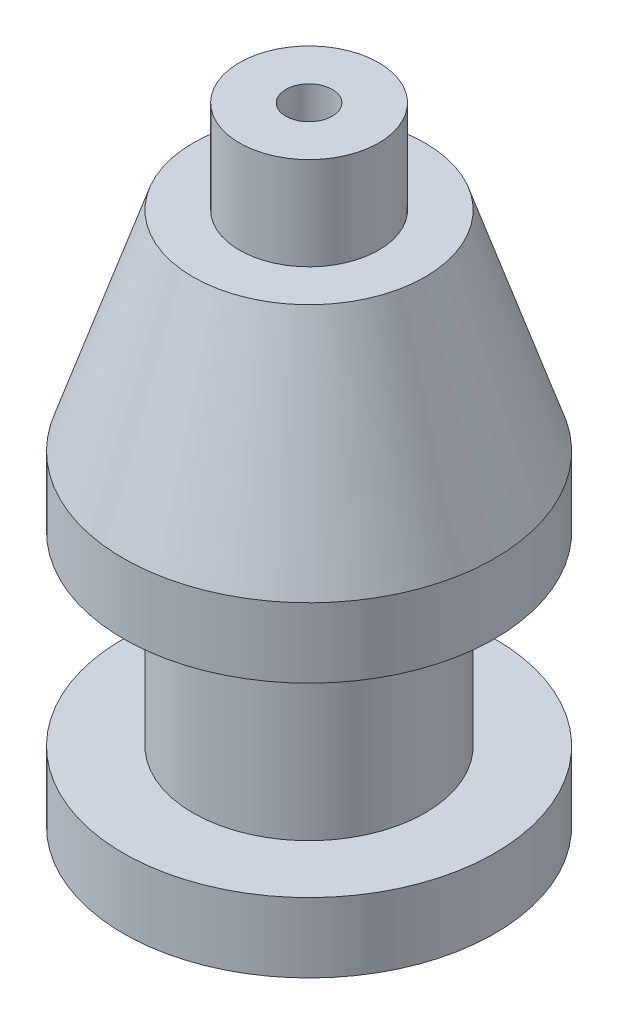
ISO-10303-21;
HEADER;
FILE_DESCRIPTION(('STEP AP214'),'2;1');
FILE_NAME('part.step','',(''),(''),'','','');
FILE_SCHEMA(('AUTOMOTIVE_DESIGN { 1 0 10303 214 1 1 1 1 }'));
ENDSEC;
DATA;
#1=APPLICATION_CONTEXT('core data for automotive mechanical design processes');
#2=APPLICATION_PROTOCOL_DEFINITION('international standard','automotive_design',2000,#1);
#3=PRODUCT_CONTEXT('',#1,'mechanical');
#4=PRODUCT('Part','Part','',(#3));
#5=PRODUCT_RELATED_PRODUCT_CATEGORY('part','',(#4));
#6=PRODUCT_DEFINITION_FORMATION('','',#4);
#7=PRODUCT_DEFINITION_CONTEXT('part definition',#1,'design');
#8=PRODUCT_DEFINITION('design','',#6,#7);
#9=PRODUCT_DEFINITION_SHAPE('','',#8);
#10=(LENGTH_UNIT() NAMED_UNIT(*) SI_UNIT(.MILLI.,.METRE.));
#11=(NAMED_UNIT(*) PLANE_ANGLE_UNIT() SI_UNIT($,.RADIAN.));
#12=(NAMED_UNIT(*) SI_UNIT($,.STERADIAN.) SOLID_ANGLE_UNIT());
#13=UNCERTAINTY_MEASURE_WITH_UNIT(LENGTH_MEASURE(1.E-05),#10,'distance_accuracy_value','');
#14=(GEOMETRIC_REPRESENTATION_CONTEXT(3) GLOBAL_UNCERTAINTY_ASSIGNED_CONTEXT((#13)) GLOBAL_UNIT_ASSIGNED_CONTEXT((#10,
#11,#12)) REPRESENTATION_CONTEXT('',''));
#15=CARTESIAN_POINT('',(0.,0.,0.));
#16=DIRECTION('',(0.,0.,1.));
#17=DIRECTION('',(1.,0.,0.));
#18=AXIS2_PLACEMENT_3D('',#15,#16,#17);
#19=CARTESIAN_POINT('',(0.,0.,0.));
#20=DIRECTION('',(0.,-1.,0.));
#21=DIRECTION('',(0.,0.,-1.));
#22=AXIS2_PLACEMENT_3D('',#19,#20,#21);
#23=CYLINDRICAL_SURFACE('',#22,10.);
#24=CARTESIAN_POINT('',(0.,-110.,0.));
#25=DIRECTION('',(0.,-1.,0.));
#26=DIRECTION('',(0.,0.,-1.));
#27=AXIS2_PLACEMENT_3D('',#24,#25,#26);
#28=CIRCLE('',#27,10.);
#29=CARTESIAN_POINT('',(0.,-110.,-10.));
#30=VERTEX_POINT('',#29);
#31=EDGE_CURVE('E10',#30,#30,#28,.T.);
#32=ORIENTED_EDGE('',*,*,#31,.T.);
#33=EDGE_LOOP('',(#32));
#34=FACE_BOUND('',#33,.T.);
#35=CARTESIAN_POINT('',(0.,160.,0.));
#36=DIRECTION('',(0.,-1.,0.));
#37=DIRECTION('',(0.,0.,-1.));
#38=AXIS2_PLACEMENT_3D('',#35,#36,#37);
#39=CIRCLE('',#38,10.);
#40=CARTESIAN_POINT('',(0.,160.,-10.));
#41=VERTEX_POINT('',#40);
#42=EDGE_CURVE('E72',#41,#41,#39,.T.);
#43=ORIENTED_EDGE('',*,*,#42,.F.);
#44=EDGE_LOOP('',(#43));
#45=FACE_BOUND('',#44,.T.);
#46=ADVANCED_FACE('F35',(#34,#45),#23,.F.);
#47=CARTESIAN_POINT('',(10.,-110.,0.));
#48=DIRECTION('',(0.,-1.,0.));
#49=DIRECTION('',(0.,0.,-1.));
#50=AXIS2_PLACEMENT_3D('',#47,#48,#49);
#51=PLANE('',#50);
#52=CARTESIAN_POINT('',(0.,-110.,0.));
#53=DIRECTION('',(0.,-1.,0.));
#54=DIRECTION('',(0.,0.,-1.));
#55=AXIS2_PLACEMENT_3D('',#52,#53,#54);
#56=CIRCLE('',#55,80.);
#57=CARTESIAN_POINT('',(0.,-110.,-80.));
#58=VERTEX_POINT('',#57);
#59=EDGE_CURVE('E41',#58,#58,#56,.T.);
#60=ORIENTED_EDGE('',*,*,#59,.T.);
#61=EDGE_LOOP('',(#60));
#62=FACE_BOUND('',#61,.T.);
#63=ORIENTED_EDGE('',*,*,#31,.F.);
#64=EDGE_LOOP('',(#63));
#65=FACE_BOUND('',#64,.T.);
#66=ADVANCED_FACE('F80',(#62,#65),#51,.T.);
#67=CARTESIAN_POINT('',(0.,0.,0.));
#68=DIRECTION('',(0.,-1.,0.));
#69=DIRECTION('',(0.,0.,-1.));
#70=AXIS2_PLACEMENT_3D('',#67,#68,#69);
#71=CYLINDRICAL_SURFACE('',#70,80.);
#72=CARTESIAN_POINT('',(0.,-80.,0.));
#73=DIRECTION('',(0.,-1.,0.));
#74=DIRECTION('',(0.,0.,-1.));
#75=AXIS2_PLACEMENT_3D('',#72,#73,#74);
#76=CIRCLE('',#75,80.);
#77=CARTESIAN_POINT('',(0.,-80.,-80.));
#78=VERTEX_POINT('',#77);
#79=EDGE_CURVE('E45',#78,#78,#76,.T.);
#80=ORIENTED_EDGE('',*,*,#79,.T.);
#81=EDGE_LOOP('',(#80));
#82=FACE_BOUND('',#81,.T.);
#83=ORIENTED_EDGE('',*,*,#59,.F.);
#84=EDGE_LOOP('',(#83));
#85=FACE_BOUND('',#84,.T.);
#86=ADVANCED_FACE('F84',(#82,#85),#71,.T.);
#87=CARTESIAN_POINT('',(80.,-80.,0.));
#88=DIRECTION('',(0.,1.,0.));
#89=DIRECTION('',(0.,0.,1.));
#90=AXIS2_PLACEMENT_3D('',#87,#88,#89);
#91=PLANE('',#90);
#92=CARTESIAN_POINT('',(0.,-80.,0.));
#93=DIRECTION('',(0.,-1.,0.));
#94=DIRECTION('',(0.,0.,-1.));
#95=AXIS2_PLACEMENT_3D('',#92,#93,#94);
#96=CIRCLE('',#95,50.);
#97=CARTESIAN_POINT('',(0.,-80.,-50.));
#98=VERTEX_POINT('',#97);
#99=EDGE_CURVE('E49',#98,#98,#96,.T.);
#100=ORIENTED_EDGE('',*,*,#99,.T.);
#101=EDGE_LOOP('',(#100));
#102=FACE_BOUND('',#101,.T.);
#103=ORIENTED_EDGE('',*,*,#79,.F.);
#104=EDGE_LOOP('',(#103));
#105=FACE_BOUND('',#104,.T.);
#106=ADVANCED_FACE('F88',(#102,#105),#91,.T.);
#107=CARTESIAN_POINT('',(0.,0.,0.));
#108=DIRECTION('',(0.,-1.,0.));
#109=DIRECTION('',(0.,0.,-1.));
#110=AXIS2_PLACEMENT_3D('',#107,#108,#109);
#111=CYLINDRICAL_SURFACE('',#110,50.);
#112=CARTESIAN_POINT('',(0.,0.,0.));
#113=DIRECTION('',(0.,-1.,0.));
#114=DIRECTION('',(0.,0.,-1.));
#115=AXIS2_PLACEMENT_3D('',#112,#113,#114);
#116=CIRCLE('',#115,50.);
#117=CARTESIAN_POINT('',(0.,0.,-50.));
#118=VERTEX_POINT('',#117);
#119=EDGE_CURVE('E54',#118,#118,#116,.T.);
#120=ORIENTED_EDGE('',*,*,#119,.T.);
#121=EDGE_LOOP('',(#120));
#122=FACE_BOUND('',#121,.T.);
#123=ORIENTED_EDGE('',*,*,#99,.F.);
#124=EDGE_LOOP('',(#123));
#125=FACE_BOUND('',#124,.T.);
#126=ADVANCED_FACE('F95',(#122,#125),#111,.T.);
#127=CARTESIAN_POINT('',(50.,0.,0.));
#128=DIRECTION('',(0.,-1.,0.));
#129=DIRECTION('',(0.,0.,-1.));
#130=AXIS2_PLACEMENT_3D('',#127,#128,#129);
#131=PLANE('',#130);
#132=CARTESIAN_POINT('',(0.,0.,0.));
#133=DIRECTION('',(0.,-1.,0.));
#134=DIRECTION('',(0.,0.,-1.));
#135=AXIS2_PLACEMENT_3D('',#132,#133,#134);
#136=CIRCLE('',#135,80.);
#137=CARTESIAN_POINT('',(0.,0.,-80.));
#138=VERTEX_POINT('',#137);
#139=EDGE_CURVE('E57',#138,#138,#136,.T.);
#140=ORIENTED_EDGE('',*,*,#139,.T.);
#141=EDGE_LOOP('',(#140));
#142=FACE_BOUND('',#141,.T.);
#143=ORIENTED_EDGE('',*,*,#119,.F.);
#144=EDGE_LOOP('',(#143));
#145=FACE_BOUND('',#144,.T.);
#146=ADVANCED_FACE('F99',(#142,#145),#131,.T.);
#147=CARTESIAN_POINT('',(0.,0.,0.));
#148=DIRECTION('',(0.,-1.,0.));
#149=DIRECTION('',(0.,0.,-1.));
#150=AXIS2_PLACEMENT_3D('',#147,#148,#149);
#151=CYLINDRICAL_SURFACE('',#150,80.);
#152=CARTESIAN_POINT('',(0.,30.,0.));
#153=DIRECTION('',(0.,-1.,0.));
#154=DIRECTION('',(0.,0.,-1.));
#155=AXIS2_PLACEMENT_3D('',#152,#153,#154);
#156=CIRCLE('',#155,80.);
#157=CARTESIAN_POINT('',(0.,30.,-80.));
#158=VERTEX_POINT('',#157);
#159=EDGE_CURVE('E60',#158,#158,#156,.T.);
#160=ORIENTED_EDGE('',*,*,#159,.T.);
#161=EDGE_LOOP('',(#160));
#162=FACE_BOUND('',#161,.T.);
#163=ORIENTED_EDGE('',*,*,#139,.F.);
#164=EDGE_LOOP('',(#163));
#165=FACE_BOUND('',#164,.T.);
#166=ADVANCED_FACE('F103',(#162,#165),#151,.T.);
#167=CARTESIAN_POINT('',(0.,30.,0.));
#168=DIRECTION('',(0.,-1.,0.));
#169=DIRECTION('',(0.,0.,-1.));
#170=AXIS2_PLACEMENT_3D('',#167,#168,#169);
#171=CONICAL_SURFACE('',#170,80.,0.321750554396642);
#172=CARTESIAN_POINT('',(0.,120.,0.));
#173=DIRECTION('',(0.,-1.,0.));
#174=DIRECTION('',(0.,0.,-1.));
#175=AXIS2_PLACEMENT_3D('',#172,#173,#174);
#176=CIRCLE('',#175,50.);
#177=CARTESIAN_POINT('',(0.,120.,-50.));
#178=VERTEX_POINT('',#177);
#179=EDGE_CURVE('E63',#178,#178,#176,.T.);
#180=ORIENTED_EDGE('',*,*,#179,.T.);
#181=EDGE_LOOP('',(#180));
#182=FACE_BOUND('',#181,.T.);
#183=ORIENTED_EDGE('',*,*,#159,.F.);
#184=EDGE_LOOP('',(#183));
#185=FACE_BOUND('',#184,.T.);
#186=ADVANCED_FACE('F107',(#182,#185),#171,.T.);
#187=CARTESIAN_POINT('',(50.,120.,0.));
#188=DIRECTION('',(0.,1.,0.));
#189=DIRECTION('',(0.,0.,1.));
#190=AXIS2_PLACEMENT_3D('',#187,#188,#189);
#191=PLANE('',#190);
#192=CARTESIAN_POINT('',(0.,120.,0.));
#193=DIRECTION('',(0.,-1.,0.));
#194=DIRECTION('',(0.,0.,-1.));
#195=AXIS2_PLACEMENT_3D('',#192,#193,#194);
#196=CIRCLE('',#195,30.);
#197=CARTESIAN_POINT('',(0.,120.,-30.));
#198=VERTEX_POINT('',#197);
#199=EDGE_CURVE('E66',#198,#198,#196,.T.);
#200=ORIENTED_EDGE('',*,*,#199,.T.);
#201=EDGE_LOOP('',(#200));
#202=FACE_BOUND('',#201,.T.);
#203=ORIENTED_EDGE('',*,*,#179,.F.);
#204=EDGE_LOOP('',(#203));
#205=FACE_BOUND('',#204,.T.);
#206=ADVANCED_FACE('F111',(#202,#205),#191,.T.);
#207=CARTESIAN_POINT('',(0.,0.,0.));
#208=DIRECTION('',(0.,-1.,0.));
#209=DIRECTION('',(0.,0.,-1.));
#210=AXIS2_PLACEMENT_3D('',#207,#208,#209);
#211=CYLINDRICAL_SURFACE('',#210,30.);
#212=CARTESIAN_POINT('',(0.,160.,0.));
#213=DIRECTION('',(0.,-1.,0.));
#214=DIRECTION('',(0.,0.,-1.));
#215=AXIS2_PLACEMENT_3D('',#212,#213,#214);
#216=CIRCLE('',#215,30.);
#217=CARTESIAN_POINT('',(0.,160.,-30.));
#218=VERTEX_POINT('',#217);
#219=EDGE_CURVE('E69',#218,#218,#216,.T.);
#220=ORIENTED_EDGE('',*,*,#219,.T.);
#221=EDGE_LOOP('',(#220));
#222=FACE_BOUND('',#221,.T.);
#223=ORIENTED_EDGE('',*,*,#199,.F.);
#224=EDGE_LOOP('',(#223));
#225=FACE_BOUND('',#224,.T.);
#226=ADVANCED_FACE('F115',(#222,#225),#211,.T.);
#227=CARTESIAN_POINT('',(30.,160.,0.));
#228=DIRECTION('',(0.,1.,0.));
#229=DIRECTION('',(0.,0.,1.));
#230=AXIS2_PLACEMENT_3D('',#227,#228,#229);
#231=PLANE('',#230);
#232=ORIENTED_EDGE('',*,*,#42,.T.);
#233=EDGE_LOOP('',(#232));
#234=FACE_BOUND('',#233,.T.);
#235=ORIENTED_EDGE('',*,*,#219,.F.);
#236=EDGE_LOOP('',(#235));
#237=FACE_BOUND('',#236,.T.);
#238=ADVANCED_FACE('F76',(#234,#237),#231,.T.);
#239=CLOSED_SHELL('',(#46,#66,#86,#106,#126,#146,#166,#186,#206,#226,#238));
#240=MANIFOLD_SOLID_BREP('B2',#239);
#241=ADVANCED_BREP_SHAPE_REPRESENTATION('',(#18,#240),#14);
#242=SHAPE_DEFINITION_REPRESENTATION(#9,#241);
ENDSEC;
END-ISO-10303-21;
